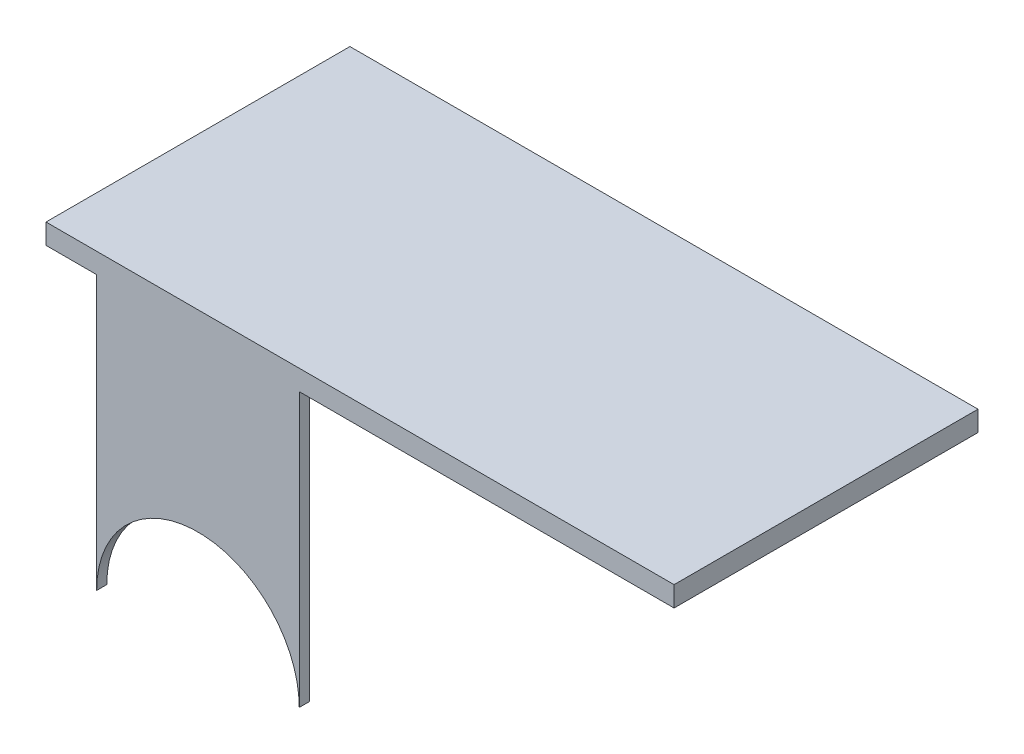
ISO-10303-21;
HEADER;
FILE_DESCRIPTION(('STEP AP214'),'2;1');
FILE_NAME('part.step','',(''),(''),'','','');
FILE_SCHEMA(('AUTOMOTIVE_DESIGN { 1 0 10303 214 1 1 1 1 }'));
ENDSEC;
DATA;
#1=APPLICATION_CONTEXT('core data for automotive mechanical design processes');
#2=APPLICATION_PROTOCOL_DEFINITION('international standard','automotive_design',2000,#1);
#3=PRODUCT_CONTEXT('',#1,'mechanical');
#4=PRODUCT('Part','Part','',(#3));
#5=PRODUCT_RELATED_PRODUCT_CATEGORY('part','',(#4));
#6=PRODUCT_DEFINITION_FORMATION('','',#4);
#7=PRODUCT_DEFINITION_CONTEXT('part definition',#1,'design');
#8=PRODUCT_DEFINITION('design','',#6,#7);
#9=PRODUCT_DEFINITION_SHAPE('','',#8);
#10=(LENGTH_UNIT() NAMED_UNIT(*) SI_UNIT(.MILLI.,.METRE.));
#11=(NAMED_UNIT(*) PLANE_ANGLE_UNIT() SI_UNIT($,.RADIAN.));
#12=(NAMED_UNIT(*) SI_UNIT($,.STERADIAN.) SOLID_ANGLE_UNIT());
#13=UNCERTAINTY_MEASURE_WITH_UNIT(LENGTH_MEASURE(1.E-05),#10,'distance_accuracy_value','');
#14=(GEOMETRIC_REPRESENTATION_CONTEXT(3) GLOBAL_UNCERTAINTY_ASSIGNED_CONTEXT((#13)) GLOBAL_UNIT_ASSIGNED_CONTEXT((#10,
#11,#12)) REPRESENTATION_CONTEXT('',''));
#15=CARTESIAN_POINT('',(0.,0.,0.));
#16=DIRECTION('',(0.,0.,1.));
#17=DIRECTION('',(1.,0.,0.));
#18=AXIS2_PLACEMENT_3D('',#15,#16,#17);
#19=CARTESIAN_POINT('',(-34.9249684990199,-5.13115650933468,1.));
#20=DIRECTION('',(0.,0.,-1.));
#21=DIRECTION('',(-1.,0.,0.));
#22=AXIS2_PLACEMENT_3D('',#19,#20,#21);
#23=CYLINDRICAL_SURFACE('',#22,10.);
#24=CARTESIAN_POINT('',(-34.9249684990199,-5.13115650933468,0.));
#25=DIRECTION('',(0.,0.,-1.));
#26=DIRECTION('',(-1.,0.,0.));
#27=AXIS2_PLACEMENT_3D('',#24,#25,#26);
#28=CIRCLE('',#27,10.);
#29=CARTESIAN_POINT('',(-44.9249684990199,-5.13115650933468,0.));
#30=VERTEX_POINT('',#29);
#31=CARTESIAN_POINT('',(-24.9249684990199,-5.13115650933468,0.));
#32=VERTEX_POINT('',#31);
#33=EDGE_CURVE('E137',#30,#32,#28,.T.);
#34=ORIENTED_EDGE('',*,*,#33,.T.);
#35=DIRECTION('',(0.,0.,-1.));
#36=VECTOR('',#35,1.);
#37=CARTESIAN_POINT('',(-24.9249684990199,-5.13115650933468,1.));
#38=LINE('',#37,#36);
#39=CARTESIAN_POINT('',(-24.9249684990199,-5.13115650933468,1.));
#40=VERTEX_POINT('',#39);
#41=EDGE_CURVE('E11',#40,#32,#38,.T.);
#42=ORIENTED_EDGE('',*,*,#41,.F.);
#43=CARTESIAN_POINT('',(-34.9249684990199,-5.13115650933468,1.));
#44=DIRECTION('',(0.,0.,-1.));
#45=DIRECTION('',(-1.,0.,0.));
#46=AXIS2_PLACEMENT_3D('',#43,#44,#45);
#47=CIRCLE('',#46,10.);
#48=CARTESIAN_POINT('',(-44.9249684990199,-5.13115650933468,1.));
#49=VERTEX_POINT('',#48);
#50=EDGE_CURVE('E148',#49,#40,#47,.T.);
#51=ORIENTED_EDGE('',*,*,#50,.F.);
#52=DIRECTION('',(0.,0.,-1.));
#53=VECTOR('',#52,1.);
#54=CARTESIAN_POINT('',(-44.9249684990199,-5.13115650933468,1.));
#55=LINE('',#54,#53);
#56=EDGE_CURVE('E154',#49,#30,#55,.T.);
#57=ORIENTED_EDGE('',*,*,#56,.T.);
#58=EDGE_LOOP('',(#34,#42,#51,#57));
#59=FACE_BOUND('',#58,.T.);
#60=ADVANCED_FACE('F39',(#59),#23,.F.);
#61=CARTESIAN_POINT('',(-24.9249684990199,21.8688434906653,1.));
#62=DIRECTION('',(-1.,0.,0.));
#63=DIRECTION('',(0.,-1.,0.));
#64=AXIS2_PLACEMENT_3D('',#61,#62,#63);
#65=PLANE('',#64);
#66=DIRECTION('',(0.,1.,0.));
#67=VECTOR('',#66,1.);
#68=CARTESIAN_POINT('',(-24.9249684990199,21.8688434906653,0.));
#69=LINE('',#68,#67);
#70=CARTESIAN_POINT('',(-24.9249684990199,21.8688434906653,0.));
#71=VERTEX_POINT('',#70);
#72=EDGE_CURVE('E142',#32,#71,#69,.T.);
#73=ORIENTED_EDGE('',*,*,#72,.T.);
#74=DIRECTION('',(0.,0.,-1.));
#75=VECTOR('',#74,1.);
#76=CARTESIAN_POINT('',(-24.9249684990199,21.8688434906653,1.));
#77=LINE('',#76,#75);
#78=CARTESIAN_POINT('',(-24.9249684990199,21.8688434906653,1.));
#79=VERTEX_POINT('',#78);
#80=EDGE_CURVE('E48',#79,#71,#77,.T.);
#81=ORIENTED_EDGE('',*,*,#80,.F.);
#82=DIRECTION('',(0.,1.,0.));
#83=VECTOR('',#82,1.);
#84=CARTESIAN_POINT('',(-24.9249684990199,21.8688434906653,1.));
#85=LINE('',#84,#83);
#86=EDGE_CURVE('E80',#40,#79,#85,.T.);
#87=ORIENTED_EDGE('',*,*,#86,.F.);
#88=ORIENTED_EDGE('',*,*,#41,.T.);
#89=EDGE_LOOP('',(#73,#81,#87,#88));
#90=FACE_BOUND('',#89,.T.);
#91=ADVANCED_FACE('F172',(#90),#65,.F.);
#92=CARTESIAN_POINT('',(-44.9249684990199,-5.13115650933468,1.));
#93=DIRECTION('',(1.,0.,0.));
#94=DIRECTION('',(0.,0.,-1.));
#95=AXIS2_PLACEMENT_3D('',#92,#93,#94);
#96=PLANE('',#95);
#97=DIRECTION('',(0.,-1.,0.));
#98=VECTOR('',#97,1.);
#99=CARTESIAN_POINT('',(-44.9249684990199,-5.13115650933468,0.));
#100=LINE('',#99,#98);
#101=CARTESIAN_POINT('',(-44.9249684990199,21.8688434906653,0.));
#102=VERTEX_POINT('',#101);
#103=EDGE_CURVE('E73',#102,#30,#100,.T.);
#104=ORIENTED_EDGE('',*,*,#103,.T.);
#105=ORIENTED_EDGE('',*,*,#56,.F.);
#106=DIRECTION('',(0.,-1.,0.));
#107=VECTOR('',#106,1.);
#108=CARTESIAN_POINT('',(-44.9249684990199,-5.13115650933468,1.));
#109=LINE('',#108,#107);
#110=CARTESIAN_POINT('',(-44.9249684990199,21.8688434906653,1.));
#111=VERTEX_POINT('',#110);
#112=EDGE_CURVE('E56',#111,#49,#109,.T.);
#113=ORIENTED_EDGE('',*,*,#112,.F.);
#114=DIRECTION('',(0.,0.,-1.));
#115=VECTOR('',#114,1.);
#116=CARTESIAN_POINT('',(-44.9249684990199,21.8688434906653,1.));
#117=LINE('',#116,#115);
#118=EDGE_CURVE('E70',#111,#102,#117,.T.);
#119=ORIENTED_EDGE('',*,*,#118,.T.);
#120=EDGE_LOOP('',(#104,#105,#113,#119));
#121=FACE_BOUND('',#120,.T.);
#122=ADVANCED_FACE('F179',(#121),#96,.F.);
#123=CARTESIAN_POINT('',(-34.9249684990199,-5.13115650933468,1.));
#124=DIRECTION('',(0.,0.,-1.));
#125=DIRECTION('',(-1.,0.,0.));
#126=AXIS2_PLACEMENT_3D('',#123,#124,#125);
#127=PLANE('',#126);
#128=ORIENTED_EDGE('',*,*,#50,.T.);
#129=ORIENTED_EDGE('',*,*,#86,.T.);
#130=DIRECTION('',(1.,0.,0.));
#131=VECTOR('',#130,1.);
#132=CARTESIAN_POINT('',(-44.9249684990199,21.8688434906653,1.));
#133=LINE('',#132,#131);
#134=CARTESIAN_POINT('',(12.0750315009801,21.8688434906653,1.));
#135=VERTEX_POINT('',#134);
#136=EDGE_CURVE('E134',#79,#135,#133,.T.);
#137=ORIENTED_EDGE('',*,*,#136,.T.);
#138=DIRECTION('',(0.,-1.,0.));
#139=VECTOR('',#138,1.);
#140=CARTESIAN_POINT('',(12.0750315009801,23.8688434906653,1.));
#141=LINE('',#140,#139);
#142=CARTESIAN_POINT('',(12.0750315009801,23.8688434906653,1.));
#143=VERTEX_POINT('',#142);
#144=EDGE_CURVE('E114',#143,#135,#141,.T.);
#145=ORIENTED_EDGE('',*,*,#144,.F.);
#146=DIRECTION('',(1.,0.,0.));
#147=VECTOR('',#146,1.);
#148=CARTESIAN_POINT('',(-44.9249684990199,23.8688434906653,1.));
#149=LINE('',#148,#147);
#150=CARTESIAN_POINT('',(-49.9249684990199,23.8688434906653,1.));
#151=VERTEX_POINT('',#150);
#152=EDGE_CURVE('E121',#151,#143,#149,.T.);
#153=ORIENTED_EDGE('',*,*,#152,.F.);
#154=DIRECTION('',(0.,-1.,0.));
#155=VECTOR('',#154,1.);
#156=CARTESIAN_POINT('',(-49.9249684990199,23.8688434906653,1.));
#157=LINE('',#156,#155);
#158=CARTESIAN_POINT('',(-49.9249684990199,21.8688434906653,1.));
#159=VERTEX_POINT('',#158);
#160=EDGE_CURVE('E182',#151,#159,#157,.T.);
#161=ORIENTED_EDGE('',*,*,#160,.T.);
#162=EDGE_CURVE('E130',#159,#111,#133,.T.);
#163=ORIENTED_EDGE('',*,*,#162,.T.);
#164=ORIENTED_EDGE('',*,*,#112,.T.);
#165=EDGE_LOOP('',(#128,#129,#137,#145,#153,#161,#163,#164));
#166=FACE_BOUND('',#165,.T.);
#167=ADVANCED_FACE('F132',(#166),#127,.F.);
#168=CARTESIAN_POINT('',(-34.9249684990199,-5.13115650933468,0.));
#169=DIRECTION('',(0.,0.,-1.));
#170=DIRECTION('',(-1.,0.,0.));
#171=AXIS2_PLACEMENT_3D('',#168,#169,#170);
#172=PLANE('',#171);
#173=ORIENTED_EDGE('',*,*,#33,.F.);
#174=ORIENTED_EDGE('',*,*,#103,.F.);
#175=DIRECTION('',(-1.,0.,0.));
#176=VECTOR('',#175,1.);
#177=CARTESIAN_POINT('',(-44.9249684990199,21.8688434906653,0.));
#178=LINE('',#177,#176);
#179=EDGE_CURVE('E159',#71,#102,#178,.T.);
#180=ORIENTED_EDGE('',*,*,#179,.F.);
#181=ORIENTED_EDGE('',*,*,#72,.F.);
#182=EDGE_LOOP('',(#173,#174,#180,#181));
#183=FACE_BOUND('',#182,.T.);
#184=ADVANCED_FACE('F176',(#183),#172,.T.);
#185=CARTESIAN_POINT('',(12.0750315009801,23.8688434906653,1.));
#186=DIRECTION('',(-1.,0.,0.));
#187=DIRECTION('',(0.,0.,1.));
#188=AXIS2_PLACEMENT_3D('',#185,#186,#187);
#189=PLANE('',#188);
#190=DIRECTION('',(0.,0.,-1.));
#191=VECTOR('',#190,1.);
#192=CARTESIAN_POINT('',(12.0750315009801,21.8688434906653,1.));
#193=LINE('',#192,#191);
#194=CARTESIAN_POINT('',(12.0750315009801,21.8688434906653,-29.));
#195=VERTEX_POINT('',#194);
#196=EDGE_CURVE('E201',#135,#195,#193,.T.);
#197=ORIENTED_EDGE('',*,*,#196,.T.);
#198=DIRECTION('',(0.,-1.,0.));
#199=VECTOR('',#198,1.);
#200=CARTESIAN_POINT('',(12.0750315009801,23.8688434906653,-29.));
#201=LINE('',#200,#199);
#202=CARTESIAN_POINT('',(12.0750315009801,23.8688434906653,-29.));
#203=VERTEX_POINT('',#202);
#204=EDGE_CURVE('E116',#203,#195,#201,.T.);
#205=ORIENTED_EDGE('',*,*,#204,.F.);
#206=DIRECTION('',(0.,0.,-1.));
#207=VECTOR('',#206,1.);
#208=CARTESIAN_POINT('',(12.0750315009801,23.8688434906653,1.));
#209=LINE('',#208,#207);
#210=EDGE_CURVE('E110',#143,#203,#209,.T.);
#211=ORIENTED_EDGE('',*,*,#210,.F.);
#212=ORIENTED_EDGE('',*,*,#144,.T.);
#213=EDGE_LOOP('',(#197,#205,#211,#212));
#214=FACE_BOUND('',#213,.T.);
#215=ADVANCED_FACE('F112',(#214),#189,.F.);
#216=CARTESIAN_POINT('',(-49.9249684990199,23.8688434906653,-29.));
#217=DIRECTION('',(0.,0.,1.));
#218=DIRECTION('',(1.,0.,0.));
#219=AXIS2_PLACEMENT_3D('',#216,#217,#218);
#220=PLANE('',#219);
#221=DIRECTION('',(-1.,0.,0.));
#222=VECTOR('',#221,1.);
#223=CARTESIAN_POINT('',(-49.9249684990199,21.8688434906653,-29.));
#224=LINE('',#223,#222);
#225=CARTESIAN_POINT('',(-49.9249684990199,21.8688434906653,-29.));
#226=VERTEX_POINT('',#225);
#227=EDGE_CURVE('E198',#195,#226,#224,.T.);
#228=ORIENTED_EDGE('',*,*,#227,.T.);
#229=DIRECTION('',(0.,-1.,0.));
#230=VECTOR('',#229,1.);
#231=CARTESIAN_POINT('',(-49.9249684990199,23.8688434906653,-29.));
#232=LINE('',#231,#230);
#233=CARTESIAN_POINT('',(-49.9249684990199,23.8688434906653,-29.));
#234=VERTEX_POINT('',#233);
#235=EDGE_CURVE('E144',#234,#226,#232,.T.);
#236=ORIENTED_EDGE('',*,*,#235,.F.);
#237=DIRECTION('',(-1.,0.,0.));
#238=VECTOR('',#237,1.);
#239=CARTESIAN_POINT('',(-49.9249684990199,23.8688434906653,-29.));
#240=LINE('',#239,#238);
#241=EDGE_CURVE('E120',#203,#234,#240,.T.);
#242=ORIENTED_EDGE('',*,*,#241,.F.);
#243=ORIENTED_EDGE('',*,*,#204,.T.);
#244=EDGE_LOOP('',(#228,#236,#242,#243));
#245=FACE_BOUND('',#244,.T.);
#246=ADVANCED_FACE('F208',(#245),#220,.F.);
#247=CARTESIAN_POINT('',(-49.9249684990199,23.8688434906653,1.));
#248=DIRECTION('',(1.,0.,0.));
#249=DIRECTION('',(0.,0.,-1.));
#250=AXIS2_PLACEMENT_3D('',#247,#248,#249);
#251=PLANE('',#250);
#252=DIRECTION('',(0.,0.,1.));
#253=VECTOR('',#252,1.);
#254=CARTESIAN_POINT('',(-49.9249684990199,21.8688434906653,1.));
#255=LINE('',#254,#253);
#256=EDGE_CURVE('E186',#226,#159,#255,.T.);
#257=ORIENTED_EDGE('',*,*,#256,.T.);
#258=ORIENTED_EDGE('',*,*,#160,.F.);
#259=DIRECTION('',(0.,0.,1.));
#260=VECTOR('',#259,1.);
#261=CARTESIAN_POINT('',(-49.9249684990199,23.8688434906653,1.));
#262=LINE('',#261,#260);
#263=EDGE_CURVE('E126',#234,#151,#262,.T.);
#264=ORIENTED_EDGE('',*,*,#263,.F.);
#265=ORIENTED_EDGE('',*,*,#235,.T.);
#266=EDGE_LOOP('',(#257,#258,#264,#265));
#267=FACE_BOUND('',#266,.T.);
#268=ADVANCED_FACE('F195',(#267),#251,.F.);
#269=CARTESIAN_POINT('',(0.,23.8688434906653,0.));
#270=DIRECTION('',(0.,1.,0.));
#271=DIRECTION('',(0.,0.,1.));
#272=AXIS2_PLACEMENT_3D('',#269,#270,#271);
#273=PLANE('',#272);
#274=ORIENTED_EDGE('',*,*,#152,.T.);
#275=ORIENTED_EDGE('',*,*,#210,.T.);
#276=ORIENTED_EDGE('',*,*,#241,.T.);
#277=ORIENTED_EDGE('',*,*,#263,.T.);
#278=EDGE_LOOP('',(#274,#275,#276,#277));
#279=FACE_BOUND('',#278,.T.);
#280=ADVANCED_FACE('F124',(#279),#273,.T.);
#281=CARTESIAN_POINT('',(0.,21.8688434906653,0.));
#282=DIRECTION('',(0.,1.,0.));
#283=DIRECTION('',(0.,0.,1.));
#284=AXIS2_PLACEMENT_3D('',#281,#282,#283);
#285=PLANE('',#284);
#286=ORIENTED_EDGE('',*,*,#118,.F.);
#287=ORIENTED_EDGE('',*,*,#162,.F.);
#288=ORIENTED_EDGE('',*,*,#256,.F.);
#289=ORIENTED_EDGE('',*,*,#227,.F.);
#290=ORIENTED_EDGE('',*,*,#196,.F.);
#291=ORIENTED_EDGE('',*,*,#136,.F.);
#292=ORIENTED_EDGE('',*,*,#80,.T.);
#293=ORIENTED_EDGE('',*,*,#179,.T.);
#294=EDGE_LOOP('',(#286,#287,#288,#289,#290,#291,#292,#293));
#295=FACE_BOUND('',#294,.T.);
#296=ADVANCED_FACE('F171',(#295),#285,.F.);
#297=CLOSED_SHELL('',(#60,#91,#122,#167,#184,#215,#246,#268,#280,#296));
#298=MANIFOLD_SOLID_BREP('B2',#297);
#299=ADVANCED_BREP_SHAPE_REPRESENTATION('',(#18,#298),#14);
#300=SHAPE_DEFINITION_REPRESENTATION(#9,#299);
ENDSEC;
END-ISO-10303-21;
